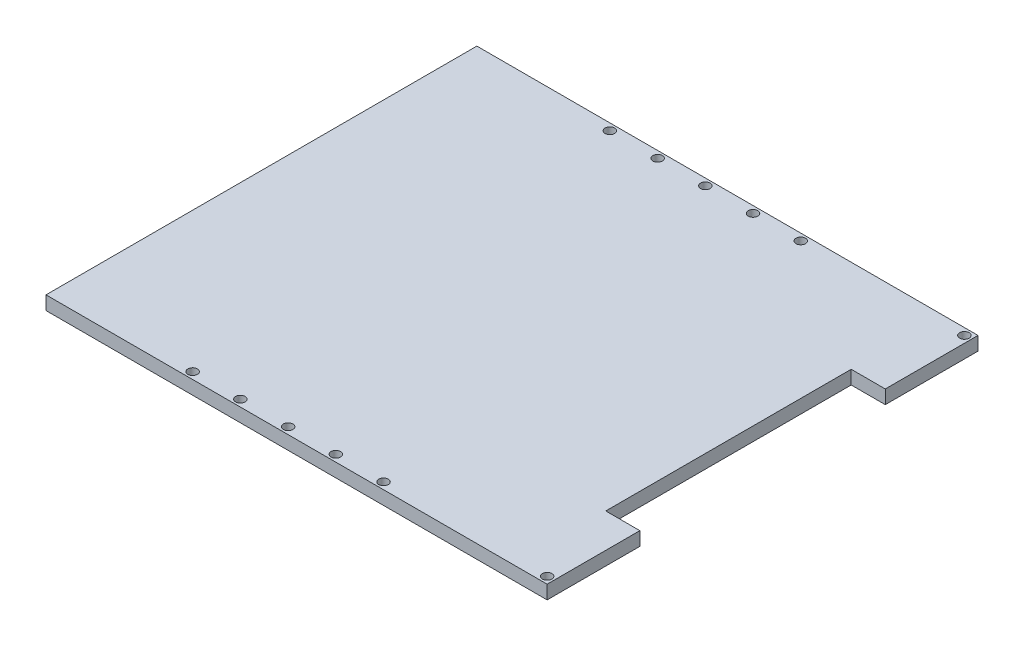
ISO-10303-21;
HEADER;
FILE_DESCRIPTION(('STEP AP214'),'2;1');
FILE_NAME('part.step','',(''),(''),'','','');
FILE_SCHEMA(('AUTOMOTIVE_DESIGN { 1 0 10303 214 1 1 1 1 }'));
ENDSEC;
DATA;
#1=APPLICATION_CONTEXT('core data for automotive mechanical design processes');
#2=APPLICATION_PROTOCOL_DEFINITION('international standard','automotive_design',2000,#1);
#3=PRODUCT_CONTEXT('',#1,'mechanical');
#4=PRODUCT('Part','Part','',(#3));
#5=PRODUCT_RELATED_PRODUCT_CATEGORY('part','',(#4));
#6=PRODUCT_DEFINITION_FORMATION('','',#4);
#7=PRODUCT_DEFINITION_CONTEXT('part definition',#1,'design');
#8=PRODUCT_DEFINITION('design','',#6,#7);
#9=PRODUCT_DEFINITION_SHAPE('','',#8);
#10=(LENGTH_UNIT() NAMED_UNIT(*) SI_UNIT(.MILLI.,.METRE.));
#11=(NAMED_UNIT(*) PLANE_ANGLE_UNIT() SI_UNIT($,.RADIAN.));
#12=(NAMED_UNIT(*) SI_UNIT($,.STERADIAN.) SOLID_ANGLE_UNIT());
#13=UNCERTAINTY_MEASURE_WITH_UNIT(LENGTH_MEASURE(1.E-05),#10,'distance_accuracy_value','');
#14=(GEOMETRIC_REPRESENTATION_CONTEXT(3) GLOBAL_UNCERTAINTY_ASSIGNED_CONTEXT((#13)) GLOBAL_UNIT_ASSIGNED_CONTEXT((#10,
#11,#12)) REPRESENTATION_CONTEXT('',''));
#15=CARTESIAN_POINT('',(0.,0.,0.));
#16=DIRECTION('',(0.,0.,1.));
#17=DIRECTION('',(1.,0.,0.));
#18=AXIS2_PLACEMENT_3D('',#15,#16,#17);
#19=CARTESIAN_POINT('',(91.885,5.,79.));
#20=DIRECTION('',(-1.,0.,0.));
#21=DIRECTION('',(0.,0.,1.));
#22=AXIS2_PLACEMENT_3D('',#19,#20,#21);
#23=PLANE('',#22);
#24=DIRECTION('',(0.,0.,-1.));
#25=VECTOR('',#24,1.);
#26=CARTESIAN_POINT('',(91.885,5.,79.));
#27=LINE('',#26,#25);
#28=CARTESIAN_POINT('',(91.885,5.,-45.));
#29=VERTEX_POINT('',#28);
#30=CARTESIAN_POINT('',(91.885,5.,-79.));
#31=VERTEX_POINT('',#30);
#32=EDGE_CURVE('E85',#29,#31,#27,.T.);
#33=ORIENTED_EDGE('',*,*,#32,.F.);
#34=DIRECTION('',(0.,-1.,0.));
#35=VECTOR('',#34,1.);
#36=CARTESIAN_POINT('',(91.885,5.,-45.));
#37=LINE('',#36,#35);
#38=CARTESIAN_POINT('',(91.885,0.,-45.));
#39=VERTEX_POINT('',#38);
#40=EDGE_CURVE('E41',#29,#39,#37,.T.);
#41=ORIENTED_EDGE('',*,*,#40,.T.);
#42=DIRECTION('',(0.,0.,-1.));
#43=VECTOR('',#42,1.);
#44=CARTESIAN_POINT('',(91.885,0.,79.));
#45=LINE('',#44,#43);
#46=CARTESIAN_POINT('',(91.885,0.,-79.));
#47=VERTEX_POINT('',#46);
#48=EDGE_CURVE('E202',#39,#47,#45,.T.);
#49=ORIENTED_EDGE('',*,*,#48,.T.);
#50=DIRECTION('',(0.,-1.,0.));
#51=VECTOR('',#50,1.);
#52=CARTESIAN_POINT('',(91.885,5.,-79.));
#53=LINE('',#52,#51);
#54=EDGE_CURVE('E226',#31,#47,#53,.T.);
#55=ORIENTED_EDGE('',*,*,#54,.F.);
#56=EDGE_LOOP('',(#33,#41,#49,#55));
#57=FACE_BOUND('',#56,.T.);
#58=ADVANCED_FACE('F33',(#57),#23,.F.);
#59=CARTESIAN_POINT('',(0.,5.,0.));
#60=DIRECTION('',(0.,-1.,0.));
#61=DIRECTION('',(0.,0.,-1.));
#62=AXIS2_PLACEMENT_3D('',#59,#60,#61);
#63=PLANE('',#62);
#64=CARTESIAN_POINT('',(-23.1149999999984,5.,76.5000000000008));
#65=DIRECTION('',(0.,1.,0.));
#66=DIRECTION('',(0.,0.,1.));
#67=AXIS2_PLACEMENT_3D('',#64,#65,#66);
#68=CIRCLE('',#67,1.75);
#69=CARTESIAN_POINT('',(-23.1149999999984,5.,78.2500000000008));
#70=VERTEX_POINT('',#69);
#71=EDGE_CURVE('E139',#70,#70,#68,.T.);
#72=ORIENTED_EDGE('',*,*,#71,.F.);
#73=EDGE_LOOP('',(#72));
#74=FACE_BOUND('',#73,.T.);
#75=CARTESIAN_POINT('',(11.8850000000016,5.,76.5000000000005));
#76=DIRECTION('',(0.,1.,0.));
#77=DIRECTION('',(0.,0.,1.));
#78=AXIS2_PLACEMENT_3D('',#75,#76,#77);
#79=CIRCLE('',#78,1.75);
#80=CARTESIAN_POINT('',(11.8850000000016,5.,78.2500000000005));
#81=VERTEX_POINT('',#80);
#82=EDGE_CURVE('E151',#81,#81,#79,.T.);
#83=ORIENTED_EDGE('',*,*,#82,.F.);
#84=EDGE_LOOP('',(#83));
#85=FACE_BOUND('',#84,.T.);
#86=CARTESIAN_POINT('',(89.3850000000016,5.,76.5));
#87=DIRECTION('',(0.,1.,0.));
#88=DIRECTION('',(0.,0.,1.));
#89=AXIS2_PLACEMENT_3D('',#86,#87,#88);
#90=CIRCLE('',#89,1.75);
#91=CARTESIAN_POINT('',(89.3850000000016,5.,78.25));
#92=VERTEX_POINT('',#91);
#93=EDGE_CURVE('E163',#92,#92,#90,.T.);
#94=ORIENTED_EDGE('',*,*,#93,.F.);
#95=EDGE_LOOP('',(#94));
#96=FACE_BOUND('',#95,.T.);
#97=CARTESIAN_POINT('',(-23.115,5.,-76.4999999999992));
#98=DIRECTION('',(0.,1.,0.));
#99=DIRECTION('',(0.,0.,1.));
#100=AXIS2_PLACEMENT_3D('',#97,#98,#99);
#101=CIRCLE('',#100,1.75);
#102=CARTESIAN_POINT('',(-23.115,5.,-74.7499999999992));
#103=VERTEX_POINT('',#102);
#104=EDGE_CURVE('E175',#103,#103,#101,.T.);
#105=ORIENTED_EDGE('',*,*,#104,.F.);
#106=EDGE_LOOP('',(#105));
#107=FACE_BOUND('',#106,.T.);
#108=CARTESIAN_POINT('',(11.885,5.,-76.4999999999995));
#109=DIRECTION('',(0.,1.,0.));
#110=DIRECTION('',(0.,0.,1.));
#111=AXIS2_PLACEMENT_3D('',#108,#109,#110);
#112=CIRCLE('',#111,1.75);
#113=CARTESIAN_POINT('',(11.885,5.,-74.7499999999995));
#114=VERTEX_POINT('',#113);
#115=EDGE_CURVE('E187',#114,#114,#112,.T.);
#116=ORIENTED_EDGE('',*,*,#115,.F.);
#117=EDGE_LOOP('',(#116));
#118=FACE_BOUND('',#117,.T.);
#119=CARTESIAN_POINT('',(89.385,5.,-76.5));
#120=DIRECTION('',(0.,1.,0.));
#121=DIRECTION('',(0.,0.,1.));
#122=AXIS2_PLACEMENT_3D('',#119,#120,#121);
#123=CIRCLE('',#122,1.75);
#124=CARTESIAN_POINT('',(89.385,5.,-74.75));
#125=VERTEX_POINT('',#124);
#126=EDGE_CURVE('E199',#125,#125,#123,.T.);
#127=ORIENTED_EDGE('',*,*,#126,.F.);
#128=EDGE_LOOP('',(#127));
#129=FACE_BOUND('',#128,.T.);
#130=DIRECTION('',(0.,0.,1.));
#131=VECTOR('',#130,1.);
#132=CARTESIAN_POINT('',(79.385,5.,45.));
#133=LINE('',#132,#131);
#134=CARTESIAN_POINT('',(79.385,5.,-45.));
#135=VERTEX_POINT('',#134);
#136=CARTESIAN_POINT('',(79.385,5.,45.));
#137=VERTEX_POINT('',#136);
#138=EDGE_CURVE('E116',#135,#137,#133,.T.);
#139=ORIENTED_EDGE('',*,*,#138,.F.);
#140=DIRECTION('',(-1.,0.,0.));
#141=VECTOR('',#140,1.);
#142=CARTESIAN_POINT('',(104.385,5.,-45.));
#143=LINE('',#142,#141);
#144=EDGE_CURVE('E113',#29,#135,#143,.T.);
#145=ORIENTED_EDGE('',*,*,#144,.F.);
#146=ORIENTED_EDGE('',*,*,#32,.T.);
#147=DIRECTION('',(-1.,0.,0.));
#148=VECTOR('',#147,1.);
#149=CARTESIAN_POINT('',(-91.885,5.,-79.));
#150=LINE('',#149,#148);
#151=CARTESIAN_POINT('',(-91.885,5.,-79.));
#152=VERTEX_POINT('',#151);
#153=EDGE_CURVE('E206',#31,#152,#150,.T.);
#154=ORIENTED_EDGE('',*,*,#153,.T.);
#155=DIRECTION('',(0.,0.,1.));
#156=VECTOR('',#155,1.);
#157=CARTESIAN_POINT('',(-91.885,5.,79.));
#158=LINE('',#157,#156);
#159=CARTESIAN_POINT('',(-91.885,5.,79.));
#160=VERTEX_POINT('',#159);
#161=EDGE_CURVE('E208',#152,#160,#158,.T.);
#162=ORIENTED_EDGE('',*,*,#161,.T.);
#163=DIRECTION('',(1.,0.,0.));
#164=VECTOR('',#163,1.);
#165=CARTESIAN_POINT('',(-91.885,5.,79.));
#166=LINE('',#165,#164);
#167=CARTESIAN_POINT('',(91.885,5.,79.));
#168=VERTEX_POINT('',#167);
#169=EDGE_CURVE('E57',#160,#168,#166,.T.);
#170=ORIENTED_EDGE('',*,*,#169,.T.);
#171=CARTESIAN_POINT('',(91.885,5.,45.));
#172=VERTEX_POINT('',#171);
#173=EDGE_CURVE('E124',#168,#172,#27,.T.);
#174=ORIENTED_EDGE('',*,*,#173,.T.);
#175=DIRECTION('',(1.,0.,0.));
#176=VECTOR('',#175,1.);
#177=CARTESIAN_POINT('',(104.385,5.,45.));
#178=LINE('',#177,#176);
#179=EDGE_CURVE('E48',#137,#172,#178,.T.);
#180=ORIENTED_EDGE('',*,*,#179,.F.);
#181=EDGE_LOOP('',(#139,#145,#146,#154,#162,#170,#174,#180));
#182=FACE_BOUND('',#181,.T.);
#183=CARTESIAN_POINT('',(29.385,5.,-76.4999999999996));
#184=DIRECTION('',(0.,1.,0.));
#185=DIRECTION('',(0.,0.,1.));
#186=AXIS2_PLACEMENT_3D('',#183,#184,#185);
#187=CIRCLE('',#186,1.75);
#188=CARTESIAN_POINT('',(29.385,5.,-74.7499999999996));
#189=VERTEX_POINT('',#188);
#190=EDGE_CURVE('E193',#189,#189,#187,.T.);
#191=ORIENTED_EDGE('',*,*,#190,.F.);
#192=EDGE_LOOP('',(#191));
#193=FACE_BOUND('',#192,.T.);
#194=CARTESIAN_POINT('',(-5.61499999999999,5.,-76.4999999999993));
#195=DIRECTION('',(0.,1.,0.));
#196=DIRECTION('',(0.,0.,1.));
#197=AXIS2_PLACEMENT_3D('',#194,#195,#196);
#198=CIRCLE('',#197,1.75);
#199=CARTESIAN_POINT('',(-5.61499999999999,5.,-74.7499999999993));
#200=VERTEX_POINT('',#199);
#201=EDGE_CURVE('E181',#200,#200,#198,.T.);
#202=ORIENTED_EDGE('',*,*,#201,.F.);
#203=EDGE_LOOP('',(#202));
#204=FACE_BOUND('',#203,.T.);
#205=CARTESIAN_POINT('',(-40.615,5.,-76.4999999999991));
#206=DIRECTION('',(0.,1.,0.));
#207=DIRECTION('',(0.,0.,1.));
#208=AXIS2_PLACEMENT_3D('',#205,#206,#207);
#209=CIRCLE('',#208,1.75);
#210=CARTESIAN_POINT('',(-40.615,5.,-74.7499999999991));
#211=VERTEX_POINT('',#210);
#212=EDGE_CURVE('E169',#211,#211,#209,.T.);
#213=ORIENTED_EDGE('',*,*,#212,.F.);
#214=EDGE_LOOP('',(#213));
#215=FACE_BOUND('',#214,.T.);
#216=CARTESIAN_POINT('',(29.3850000000016,5.,76.5000000000004));
#217=DIRECTION('',(0.,1.,0.));
#218=DIRECTION('',(0.,0.,1.));
#219=AXIS2_PLACEMENT_3D('',#216,#217,#218);
#220=CIRCLE('',#219,1.75);
#221=CARTESIAN_POINT('',(29.3850000000016,5.,78.2500000000004));
#222=VERTEX_POINT('',#221);
#223=EDGE_CURVE('E157',#222,#222,#220,.T.);
#224=ORIENTED_EDGE('',*,*,#223,.F.);
#225=EDGE_LOOP('',(#224));
#226=FACE_BOUND('',#225,.T.);
#227=CARTESIAN_POINT('',(-5.61499999999839,5.,76.5000000000007));
#228=DIRECTION('',(0.,1.,0.));
#229=DIRECTION('',(0.,0.,1.));
#230=AXIS2_PLACEMENT_3D('',#227,#228,#229);
#231=CIRCLE('',#230,1.75);
#232=CARTESIAN_POINT('',(-5.61499999999839,5.,78.2500000000007));
#233=VERTEX_POINT('',#232);
#234=EDGE_CURVE('E145',#233,#233,#231,.T.);
#235=ORIENTED_EDGE('',*,*,#234,.F.);
#236=EDGE_LOOP('',(#235));
#237=FACE_BOUND('',#236,.T.);
#238=CARTESIAN_POINT('',(-40.6149999999984,5.,76.5000000000009));
#239=DIRECTION('',(0.,1.,0.));
#240=DIRECTION('',(0.,0.,1.));
#241=AXIS2_PLACEMENT_3D('',#238,#239,#240);
#242=CIRCLE('',#241,1.75);
#243=CARTESIAN_POINT('',(-40.6149999999984,5.,78.2500000000009));
#244=VERTEX_POINT('',#243);
#245=EDGE_CURVE('E133',#244,#244,#242,.T.);
#246=ORIENTED_EDGE('',*,*,#245,.F.);
#247=EDGE_LOOP('',(#246));
#248=FACE_BOUND('',#247,.T.);
#249=ADVANCED_FACE('F121',(#74,#85,#96,#107,#118,#129,#182,#193,#204,#215,#226,#237,#248),#63,.F.);
#250=CARTESIAN_POINT('',(0.,0.,0.));
#251=DIRECTION('',(0.,-1.,0.));
#252=DIRECTION('',(0.,0.,-1.));
#253=AXIS2_PLACEMENT_3D('',#250,#251,#252);
#254=PLANE('',#253);
#255=DIRECTION('',(1.,0.,0.));
#256=VECTOR('',#255,1.);
#257=CARTESIAN_POINT('',(0.,0.,-45.));
#258=LINE('',#257,#256);
#259=CARTESIAN_POINT('',(79.385,0.,-45.));
#260=VERTEX_POINT('',#259);
#261=EDGE_CURVE('E130',#260,#39,#258,.T.);
#262=ORIENTED_EDGE('',*,*,#261,.F.);
#263=DIRECTION('',(0.,0.,-1.));
#264=VECTOR('',#263,1.);
#265=CARTESIAN_POINT('',(79.385,0.,0.));
#266=LINE('',#265,#264);
#267=CARTESIAN_POINT('',(79.385,0.,45.));
#268=VERTEX_POINT('',#267);
#269=EDGE_CURVE('E11',#268,#260,#266,.T.);
#270=ORIENTED_EDGE('',*,*,#269,.F.);
#271=DIRECTION('',(-1.,0.,0.));
#272=VECTOR('',#271,1.);
#273=CARTESIAN_POINT('',(0.,0.,45.));
#274=LINE('',#273,#272);
#275=CARTESIAN_POINT('',(91.885,0.,45.));
#276=VERTEX_POINT('',#275);
#277=EDGE_CURVE('E109',#276,#268,#274,.T.);
#278=ORIENTED_EDGE('',*,*,#277,.F.);
#279=CARTESIAN_POINT('',(91.885,0.,79.));
#280=VERTEX_POINT('',#279);
#281=EDGE_CURVE('E212',#280,#276,#45,.T.);
#282=ORIENTED_EDGE('',*,*,#281,.F.);
#283=DIRECTION('',(1.,0.,0.));
#284=VECTOR('',#283,1.);
#285=CARTESIAN_POINT('',(-91.885,0.,79.));
#286=LINE('',#285,#284);
#287=CARTESIAN_POINT('',(-91.885,0.,79.));
#288=VERTEX_POINT('',#287);
#289=EDGE_CURVE('E78',#288,#280,#286,.T.);
#290=ORIENTED_EDGE('',*,*,#289,.F.);
#291=DIRECTION('',(0.,0.,1.));
#292=VECTOR('',#291,1.);
#293=CARTESIAN_POINT('',(-91.885,0.,79.));
#294=LINE('',#293,#292);
#295=CARTESIAN_POINT('',(-91.885,0.,-79.));
#296=VERTEX_POINT('',#295);
#297=EDGE_CURVE('E217',#296,#288,#294,.T.);
#298=ORIENTED_EDGE('',*,*,#297,.F.);
#299=DIRECTION('',(-1.,0.,0.));
#300=VECTOR('',#299,1.);
#301=CARTESIAN_POINT('',(-91.885,0.,-79.));
#302=LINE('',#301,#300);
#303=EDGE_CURVE('E215',#47,#296,#302,.T.);
#304=ORIENTED_EDGE('',*,*,#303,.F.);
#305=ORIENTED_EDGE('',*,*,#48,.F.);
#306=EDGE_LOOP('',(#262,#270,#278,#282,#290,#298,#304,#305));
#307=FACE_BOUND('',#306,.T.);
#308=CARTESIAN_POINT('',(-23.1149999999984,0.,76.5000000000008));
#309=DIRECTION('',(0.,1.,0.));
#310=DIRECTION('',(0.,0.,1.));
#311=AXIS2_PLACEMENT_3D('',#308,#309,#310);
#312=CIRCLE('',#311,1.75);
#313=CARTESIAN_POINT('',(-23.1149999999984,0.,78.2500000000008));
#314=VERTEX_POINT('',#313);
#315=EDGE_CURVE('E136',#314,#314,#312,.T.);
#316=ORIENTED_EDGE('',*,*,#315,.T.);
#317=EDGE_LOOP('',(#316));
#318=FACE_BOUND('',#317,.T.);
#319=CARTESIAN_POINT('',(11.8850000000016,0.,76.5000000000005));
#320=DIRECTION('',(0.,1.,0.));
#321=DIRECTION('',(0.,0.,1.));
#322=AXIS2_PLACEMENT_3D('',#319,#320,#321);
#323=CIRCLE('',#322,1.75);
#324=CARTESIAN_POINT('',(11.8850000000016,0.,78.2500000000005));
#325=VERTEX_POINT('',#324);
#326=EDGE_CURVE('E148',#325,#325,#323,.T.);
#327=ORIENTED_EDGE('',*,*,#326,.T.);
#328=EDGE_LOOP('',(#327));
#329=FACE_BOUND('',#328,.T.);
#330=CARTESIAN_POINT('',(89.3850000000016,0.,76.5));
#331=DIRECTION('',(0.,1.,0.));
#332=DIRECTION('',(0.,0.,1.));
#333=AXIS2_PLACEMENT_3D('',#330,#331,#332);
#334=CIRCLE('',#333,1.75);
#335=CARTESIAN_POINT('',(89.3850000000016,0.,78.25));
#336=VERTEX_POINT('',#335);
#337=EDGE_CURVE('E160',#336,#336,#334,.T.);
#338=ORIENTED_EDGE('',*,*,#337,.T.);
#339=EDGE_LOOP('',(#338));
#340=FACE_BOUND('',#339,.T.);
#341=CARTESIAN_POINT('',(-23.115,0.,-76.4999999999992));
#342=DIRECTION('',(0.,1.,0.));
#343=DIRECTION('',(0.,0.,1.));
#344=AXIS2_PLACEMENT_3D('',#341,#342,#343);
#345=CIRCLE('',#344,1.75);
#346=CARTESIAN_POINT('',(-23.115,0.,-74.7499999999992));
#347=VERTEX_POINT('',#346);
#348=EDGE_CURVE('E172',#347,#347,#345,.T.);
#349=ORIENTED_EDGE('',*,*,#348,.T.);
#350=EDGE_LOOP('',(#349));
#351=FACE_BOUND('',#350,.T.);
#352=CARTESIAN_POINT('',(11.885,0.,-76.4999999999995));
#353=DIRECTION('',(0.,1.,0.));
#354=DIRECTION('',(0.,0.,1.));
#355=AXIS2_PLACEMENT_3D('',#352,#353,#354);
#356=CIRCLE('',#355,1.75);
#357=CARTESIAN_POINT('',(11.885,0.,-74.7499999999995));
#358=VERTEX_POINT('',#357);
#359=EDGE_CURVE('E184',#358,#358,#356,.T.);
#360=ORIENTED_EDGE('',*,*,#359,.T.);
#361=EDGE_LOOP('',(#360));
#362=FACE_BOUND('',#361,.T.);
#363=CARTESIAN_POINT('',(89.385,0.,-76.5));
#364=DIRECTION('',(0.,1.,0.));
#365=DIRECTION('',(0.,0.,1.));
#366=AXIS2_PLACEMENT_3D('',#363,#364,#365);
#367=CIRCLE('',#366,1.75);
#368=CARTESIAN_POINT('',(89.385,0.,-74.75));
#369=VERTEX_POINT('',#368);
#370=EDGE_CURVE('E196',#369,#369,#367,.T.);
#371=ORIENTED_EDGE('',*,*,#370,.T.);
#372=EDGE_LOOP('',(#371));
#373=FACE_BOUND('',#372,.T.);
#374=CARTESIAN_POINT('',(29.385,0.,-76.4999999999996));
#375=DIRECTION('',(0.,1.,0.));
#376=DIRECTION('',(0.,0.,1.));
#377=AXIS2_PLACEMENT_3D('',#374,#375,#376);
#378=CIRCLE('',#377,1.75);
#379=CARTESIAN_POINT('',(29.385,0.,-74.7499999999996));
#380=VERTEX_POINT('',#379);
#381=EDGE_CURVE('E190',#380,#380,#378,.T.);
#382=ORIENTED_EDGE('',*,*,#381,.T.);
#383=EDGE_LOOP('',(#382));
#384=FACE_BOUND('',#383,.T.);
#385=CARTESIAN_POINT('',(-5.61499999999999,0.,-76.4999999999993));
#386=DIRECTION('',(0.,1.,0.));
#387=DIRECTION('',(0.,0.,1.));
#388=AXIS2_PLACEMENT_3D('',#385,#386,#387);
#389=CIRCLE('',#388,1.75);
#390=CARTESIAN_POINT('',(-5.61499999999999,0.,-74.7499999999993));
#391=VERTEX_POINT('',#390);
#392=EDGE_CURVE('E178',#391,#391,#389,.T.);
#393=ORIENTED_EDGE('',*,*,#392,.T.);
#394=EDGE_LOOP('',(#393));
#395=FACE_BOUND('',#394,.T.);
#396=CARTESIAN_POINT('',(-40.615,0.,-76.4999999999991));
#397=DIRECTION('',(0.,1.,0.));
#398=DIRECTION('',(0.,0.,1.));
#399=AXIS2_PLACEMENT_3D('',#396,#397,#398);
#400=CIRCLE('',#399,1.75);
#401=CARTESIAN_POINT('',(-40.615,0.,-74.7499999999991));
#402=VERTEX_POINT('',#401);
#403=EDGE_CURVE('E166',#402,#402,#400,.T.);
#404=ORIENTED_EDGE('',*,*,#403,.T.);
#405=EDGE_LOOP('',(#404));
#406=FACE_BOUND('',#405,.T.);
#407=CARTESIAN_POINT('',(29.3850000000016,0.,76.5000000000004));
#408=DIRECTION('',(0.,1.,0.));
#409=DIRECTION('',(0.,0.,1.));
#410=AXIS2_PLACEMENT_3D('',#407,#408,#409);
#411=CIRCLE('',#410,1.75);
#412=CARTESIAN_POINT('',(29.3850000000016,0.,78.2500000000004));
#413=VERTEX_POINT('',#412);
#414=EDGE_CURVE('E154',#413,#413,#411,.T.);
#415=ORIENTED_EDGE('',*,*,#414,.T.);
#416=EDGE_LOOP('',(#415));
#417=FACE_BOUND('',#416,.T.);
#418=CARTESIAN_POINT('',(-5.61499999999839,0.,76.5000000000007));
#419=DIRECTION('',(0.,1.,0.));
#420=DIRECTION('',(0.,0.,1.));
#421=AXIS2_PLACEMENT_3D('',#418,#419,#420);
#422=CIRCLE('',#421,1.75);
#423=CARTESIAN_POINT('',(-5.61499999999839,0.,78.2500000000007));
#424=VERTEX_POINT('',#423);
#425=EDGE_CURVE('E142',#424,#424,#422,.T.);
#426=ORIENTED_EDGE('',*,*,#425,.T.);
#427=EDGE_LOOP('',(#426));
#428=FACE_BOUND('',#427,.T.);
#429=CARTESIAN_POINT('',(-40.6149999999984,0.,76.5000000000009));
#430=DIRECTION('',(0.,1.,0.));
#431=DIRECTION('',(0.,0.,1.));
#432=AXIS2_PLACEMENT_3D('',#429,#430,#431);
#433=CIRCLE('',#432,1.75);
#434=CARTESIAN_POINT('',(-40.6149999999984,0.,78.2500000000009));
#435=VERTEX_POINT('',#434);
#436=EDGE_CURVE('E132',#435,#435,#433,.T.);
#437=ORIENTED_EDGE('',*,*,#436,.T.);
#438=EDGE_LOOP('',(#437));
#439=FACE_BOUND('',#438,.T.);
#440=ADVANCED_FACE('F238',(#307,#318,#329,#340,#351,#362,#373,#384,#395,#406,#417,#428,#439),
#254,.T.);
#441=ORIENTED_EDGE('',*,*,#281,.T.);
#442=DIRECTION('',(0.,1.,0.));
#443=VECTOR('',#442,1.);
#444=CARTESIAN_POINT('',(91.885,5.,45.));
#445=LINE('',#444,#443);
#446=EDGE_CURVE('E229',#276,#172,#445,.T.);
#447=ORIENTED_EDGE('',*,*,#446,.T.);
#448=ORIENTED_EDGE('',*,*,#173,.F.);
#449=DIRECTION('',(0.,-1.,0.));
#450=VECTOR('',#449,1.);
#451=CARTESIAN_POINT('',(91.885,5.,79.));
#452=LINE('',#451,#450);
#453=EDGE_CURVE('E211',#168,#280,#452,.T.);
#454=ORIENTED_EDGE('',*,*,#453,.T.);
#455=EDGE_LOOP('',(#441,#447,#448,#454));
#456=FACE_BOUND('',#455,.T.);
#457=ADVANCED_FACE('F35',(#456),#23,.F.);
#458=CARTESIAN_POINT('',(-91.885,5.,-79.));
#459=DIRECTION('',(0.,0.,1.));
#460=DIRECTION('',(1.,0.,0.));
#461=AXIS2_PLACEMENT_3D('',#458,#459,#460);
#462=PLANE('',#461);
#463=ORIENTED_EDGE('',*,*,#303,.T.);
#464=DIRECTION('',(0.,-1.,0.));
#465=VECTOR('',#464,1.);
#466=CARTESIAN_POINT('',(-91.885,5.,-79.));
#467=LINE('',#466,#465);
#468=EDGE_CURVE('E223',#152,#296,#467,.T.);
#469=ORIENTED_EDGE('',*,*,#468,.F.);
#470=ORIENTED_EDGE('',*,*,#153,.F.);
#471=ORIENTED_EDGE('',*,*,#54,.T.);
#472=EDGE_LOOP('',(#463,#469,#470,#471));
#473=FACE_BOUND('',#472,.T.);
#474=ADVANCED_FACE('F243',(#473),#462,.F.);
#475=CARTESIAN_POINT('',(-91.885,5.,79.));
#476=DIRECTION('',(1.,0.,0.));
#477=DIRECTION('',(0.,0.,-1.));
#478=AXIS2_PLACEMENT_3D('',#475,#476,#477);
#479=PLANE('',#478);
#480=ORIENTED_EDGE('',*,*,#297,.T.);
#481=DIRECTION('',(0.,-1.,0.));
#482=VECTOR('',#481,1.);
#483=CARTESIAN_POINT('',(-91.885,5.,79.));
#484=LINE('',#483,#482);
#485=EDGE_CURVE('E221',#160,#288,#484,.T.);
#486=ORIENTED_EDGE('',*,*,#485,.F.);
#487=ORIENTED_EDGE('',*,*,#161,.F.);
#488=ORIENTED_EDGE('',*,*,#468,.T.);
#489=EDGE_LOOP('',(#480,#486,#487,#488));
#490=FACE_BOUND('',#489,.T.);
#491=ADVANCED_FACE('F247',(#490),#479,.F.);
#492=CARTESIAN_POINT('',(-91.885,5.,79.));
#493=DIRECTION('',(0.,0.,-1.));
#494=DIRECTION('',(-1.,0.,0.));
#495=AXIS2_PLACEMENT_3D('',#492,#493,#494);
#496=PLANE('',#495);
#497=ORIENTED_EDGE('',*,*,#289,.T.);
#498=ORIENTED_EDGE('',*,*,#453,.F.);
#499=ORIENTED_EDGE('',*,*,#169,.F.);
#500=ORIENTED_EDGE('',*,*,#485,.T.);
#501=EDGE_LOOP('',(#497,#498,#499,#500));
#502=FACE_BOUND('',#501,.T.);
#503=ADVANCED_FACE('F248',(#502),#496,.F.);
#504=CARTESIAN_POINT('',(89.385,5.,-76.5));
#505=DIRECTION('',(0.,-1.,0.));
#506=DIRECTION('',(0.,0.,-1.));
#507=AXIS2_PLACEMENT_3D('',#504,#505,#506);
#508=CYLINDRICAL_SURFACE('',#507,1.75);
#509=ORIENTED_EDGE('',*,*,#126,.T.);
#510=EDGE_LOOP('',(#509));
#511=FACE_BOUND('',#510,.T.);
#512=ORIENTED_EDGE('',*,*,#370,.F.);
#513=EDGE_LOOP('',(#512));
#514=FACE_BOUND('',#513,.T.);
#515=ADVANCED_FACE('F281',(#511,#514),#508,.F.);
#516=CARTESIAN_POINT('',(29.385,5.,-76.4999999999996));
#517=DIRECTION('',(0.,-1.,0.));
#518=DIRECTION('',(0.,0.,-1.));
#519=AXIS2_PLACEMENT_3D('',#516,#517,#518);
#520=CYLINDRICAL_SURFACE('',#519,1.75);
#521=ORIENTED_EDGE('',*,*,#190,.T.);
#522=EDGE_LOOP('',(#521));
#523=FACE_BOUND('',#522,.T.);
#524=ORIENTED_EDGE('',*,*,#381,.F.);
#525=EDGE_LOOP('',(#524));
#526=FACE_BOUND('',#525,.T.);
#527=ADVANCED_FACE('F297',(#523,#526),#520,.F.);
#528=CARTESIAN_POINT('',(11.885,5.,-76.4999999999995));
#529=DIRECTION('',(0.,-1.,0.));
#530=DIRECTION('',(0.,0.,-1.));
#531=AXIS2_PLACEMENT_3D('',#528,#529,#530);
#532=CYLINDRICAL_SURFACE('',#531,1.75);
#533=ORIENTED_EDGE('',*,*,#115,.T.);
#534=EDGE_LOOP('',(#533));
#535=FACE_BOUND('',#534,.T.);
#536=ORIENTED_EDGE('',*,*,#359,.F.);
#537=EDGE_LOOP('',(#536));
#538=FACE_BOUND('',#537,.T.);
#539=ADVANCED_FACE('F304',(#535,#538),#532,.F.);
#540=CARTESIAN_POINT('',(-5.61499999999999,5.,-76.4999999999993));
#541=DIRECTION('',(0.,-1.,0.));
#542=DIRECTION('',(0.,0.,-1.));
#543=AXIS2_PLACEMENT_3D('',#540,#541,#542);
#544=CYLINDRICAL_SURFACE('',#543,1.75);
#545=ORIENTED_EDGE('',*,*,#201,.T.);
#546=EDGE_LOOP('',(#545));
#547=FACE_BOUND('',#546,.T.);
#548=ORIENTED_EDGE('',*,*,#392,.F.);
#549=EDGE_LOOP('',(#548));
#550=FACE_BOUND('',#549,.T.);
#551=ADVANCED_FACE('F312',(#547,#550),#544,.F.);
#552=CARTESIAN_POINT('',(-23.115,5.,-76.4999999999992));
#553=DIRECTION('',(0.,-1.,0.));
#554=DIRECTION('',(0.,0.,-1.));
#555=AXIS2_PLACEMENT_3D('',#552,#553,#554);
#556=CYLINDRICAL_SURFACE('',#555,1.75);
#557=ORIENTED_EDGE('',*,*,#104,.T.);
#558=EDGE_LOOP('',(#557));
#559=FACE_BOUND('',#558,.T.);
#560=ORIENTED_EDGE('',*,*,#348,.F.);
#561=EDGE_LOOP('',(#560));
#562=FACE_BOUND('',#561,.T.);
#563=ADVANCED_FACE('F320',(#559,#562),#556,.F.);
#564=CARTESIAN_POINT('',(-40.615,5.,-76.4999999999991));
#565=DIRECTION('',(0.,-1.,0.));
#566=DIRECTION('',(0.,0.,-1.));
#567=AXIS2_PLACEMENT_3D('',#564,#565,#566);
#568=CYLINDRICAL_SURFACE('',#567,1.75);
#569=ORIENTED_EDGE('',*,*,#212,.T.);
#570=EDGE_LOOP('',(#569));
#571=FACE_BOUND('',#570,.T.);
#572=ORIENTED_EDGE('',*,*,#403,.F.);
#573=EDGE_LOOP('',(#572));
#574=FACE_BOUND('',#573,.T.);
#575=ADVANCED_FACE('F328',(#571,#574),#568,.F.);
#576=CARTESIAN_POINT('',(89.3850000000016,5.,76.5));
#577=DIRECTION('',(0.,-1.,0.));
#578=DIRECTION('',(0.,0.,-1.));
#579=AXIS2_PLACEMENT_3D('',#576,#577,#578);
#580=CYLINDRICAL_SURFACE('',#579,1.75);
#581=ORIENTED_EDGE('',*,*,#93,.T.);
#582=EDGE_LOOP('',(#581));
#583=FACE_BOUND('',#582,.T.);
#584=ORIENTED_EDGE('',*,*,#337,.F.);
#585=EDGE_LOOP('',(#584));
#586=FACE_BOUND('',#585,.T.);
#587=ADVANCED_FACE('F336',(#583,#586),#580,.F.);
#588=CARTESIAN_POINT('',(29.3850000000016,5.,76.5000000000004));
#589=DIRECTION('',(0.,-1.,0.));
#590=DIRECTION('',(0.,0.,-1.));
#591=AXIS2_PLACEMENT_3D('',#588,#589,#590);
#592=CYLINDRICAL_SURFACE('',#591,1.75);
#593=ORIENTED_EDGE('',*,*,#223,.T.);
#594=EDGE_LOOP('',(#593));
#595=FACE_BOUND('',#594,.T.);
#596=ORIENTED_EDGE('',*,*,#414,.F.);
#597=EDGE_LOOP('',(#596));
#598=FACE_BOUND('',#597,.T.);
#599=ADVANCED_FACE('F344',(#595,#598),#592,.F.);
#600=CARTESIAN_POINT('',(11.8850000000016,5.,76.5000000000005));
#601=DIRECTION('',(0.,-1.,0.));
#602=DIRECTION('',(0.,0.,-1.));
#603=AXIS2_PLACEMENT_3D('',#600,#601,#602);
#604=CYLINDRICAL_SURFACE('',#603,1.75);
#605=ORIENTED_EDGE('',*,*,#82,.T.);
#606=EDGE_LOOP('',(#605));
#607=FACE_BOUND('',#606,.T.);
#608=ORIENTED_EDGE('',*,*,#326,.F.);
#609=EDGE_LOOP('',(#608));
#610=FACE_BOUND('',#609,.T.);
#611=ADVANCED_FACE('F352',(#607,#610),#604,.F.);
#612=CARTESIAN_POINT('',(-5.61499999999839,5.,76.5000000000007));
#613=DIRECTION('',(0.,-1.,0.));
#614=DIRECTION('',(0.,0.,-1.));
#615=AXIS2_PLACEMENT_3D('',#612,#613,#614);
#616=CYLINDRICAL_SURFACE('',#615,1.75);
#617=ORIENTED_EDGE('',*,*,#234,.T.);
#618=EDGE_LOOP('',(#617));
#619=FACE_BOUND('',#618,.T.);
#620=ORIENTED_EDGE('',*,*,#425,.F.);
#621=EDGE_LOOP('',(#620));
#622=FACE_BOUND('',#621,.T.);
#623=ADVANCED_FACE('F360',(#619,#622),#616,.F.);
#624=CARTESIAN_POINT('',(-23.1149999999984,5.,76.5000000000008));
#625=DIRECTION('',(0.,-1.,0.));
#626=DIRECTION('',(0.,0.,-1.));
#627=AXIS2_PLACEMENT_3D('',#624,#625,#626);
#628=CYLINDRICAL_SURFACE('',#627,1.75);
#629=ORIENTED_EDGE('',*,*,#71,.T.);
#630=EDGE_LOOP('',(#629));
#631=FACE_BOUND('',#630,.T.);
#632=ORIENTED_EDGE('',*,*,#315,.F.);
#633=EDGE_LOOP('',(#632));
#634=FACE_BOUND('',#633,.T.);
#635=ADVANCED_FACE('F368',(#631,#634),#628,.F.);
#636=CARTESIAN_POINT('',(-40.6149999999984,5.,76.5000000000009));
#637=DIRECTION('',(0.,-1.,0.));
#638=DIRECTION('',(0.,0.,-1.));
#639=AXIS2_PLACEMENT_3D('',#636,#637,#638);
#640=CYLINDRICAL_SURFACE('',#639,1.75);
#641=ORIENTED_EDGE('',*,*,#245,.T.);
#642=EDGE_LOOP('',(#641));
#643=FACE_BOUND('',#642,.T.);
#644=ORIENTED_EDGE('',*,*,#436,.F.);
#645=EDGE_LOOP('',(#644));
#646=FACE_BOUND('',#645,.T.);
#647=ADVANCED_FACE('F259',(#643,#646),#640,.F.);
#648=CARTESIAN_POINT('',(79.385,-5.,45.));
#649=DIRECTION('',(-1.,0.,0.));
#650=DIRECTION('',(0.,0.,1.));
#651=AXIS2_PLACEMENT_3D('',#648,#649,#650);
#652=PLANE('',#651);
#653=ORIENTED_EDGE('',*,*,#269,.T.);
#654=DIRECTION('',(0.,1.,0.));
#655=VECTOR('',#654,1.);
#656=CARTESIAN_POINT('',(79.385,-5.,-45.));
#657=LINE('',#656,#655);
#658=EDGE_CURVE('E112',#260,#135,#657,.T.);
#659=ORIENTED_EDGE('',*,*,#658,.T.);
#660=ORIENTED_EDGE('',*,*,#138,.T.);
#661=DIRECTION('',(0.,1.,0.));
#662=VECTOR('',#661,1.);
#663=CARTESIAN_POINT('',(79.385,-5.,45.));
#664=LINE('',#663,#662);
#665=EDGE_CURVE('E105',#268,#137,#664,.T.);
#666=ORIENTED_EDGE('',*,*,#665,.F.);
#667=EDGE_LOOP('',(#653,#659,#660,#666));
#668=FACE_BOUND('',#667,.T.);
#669=ADVANCED_FACE('F117',(#668),#652,.F.);
#670=CARTESIAN_POINT('',(104.385,-5.,-45.));
#671=DIRECTION('',(0.,0.,-1.));
#672=DIRECTION('',(-1.,0.,0.));
#673=AXIS2_PLACEMENT_3D('',#670,#671,#672);
#674=PLANE('',#673);
#675=ORIENTED_EDGE('',*,*,#261,.T.);
#676=ORIENTED_EDGE('',*,*,#40,.F.);
#677=ORIENTED_EDGE('',*,*,#144,.T.);
#678=ORIENTED_EDGE('',*,*,#658,.F.);
#679=EDGE_LOOP('',(#675,#676,#677,#678));
#680=FACE_BOUND('',#679,.T.);
#681=ADVANCED_FACE('F251',(#680),#674,.F.);
#682=CARTESIAN_POINT('',(104.385,-5.,45.));
#683=DIRECTION('',(0.,0.,1.));
#684=DIRECTION('',(1.,0.,0.));
#685=AXIS2_PLACEMENT_3D('',#682,#683,#684);
#686=PLANE('',#685);
#687=ORIENTED_EDGE('',*,*,#277,.T.);
#688=ORIENTED_EDGE('',*,*,#665,.T.);
#689=ORIENTED_EDGE('',*,*,#179,.T.);
#690=ORIENTED_EDGE('',*,*,#446,.F.);
#691=EDGE_LOOP('',(#687,#688,#689,#690));
#692=FACE_BOUND('',#691,.T.);
#693=ADVANCED_FACE('F107',(#692),#686,.F.);
#694=CLOSED_SHELL('',(#58,#249,#440,#457,#474,#491,#503,#515,#527,#539,#551,#563,#575,#587,#599,
#611,#623,#635,#647,#669,#681,#693));
#695=MANIFOLD_SOLID_BREP('B2',#694);
#696=ADVANCED_BREP_SHAPE_REPRESENTATION('',(#18,#695),#14);
#697=SHAPE_DEFINITION_REPRESENTATION(#9,#696);
ENDSEC;
END-ISO-10303-21;
